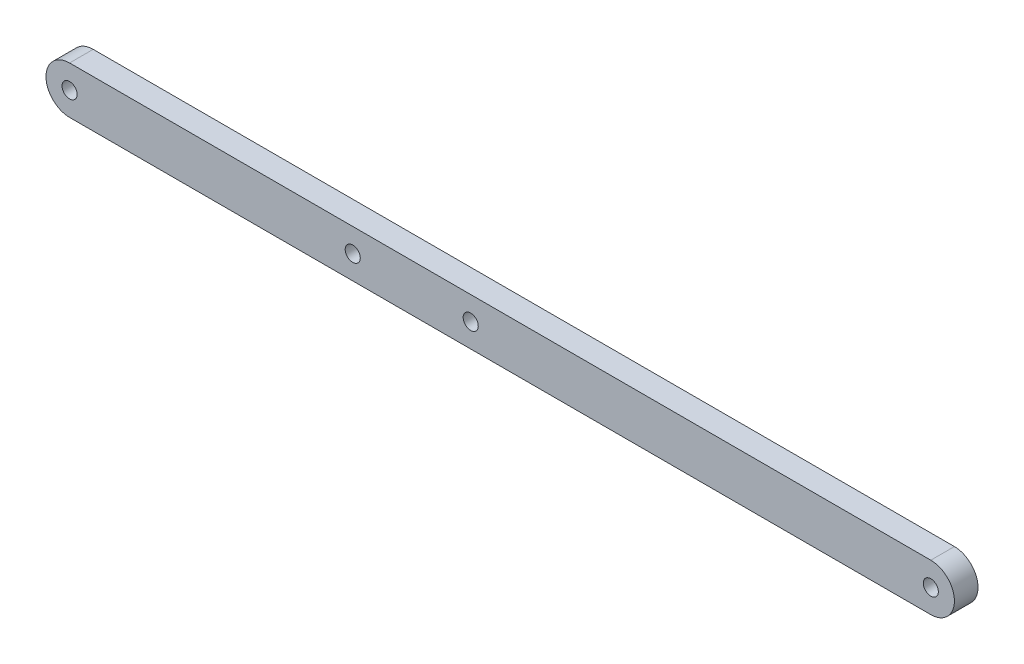
ISO-10303-21;
HEADER;
FILE_DESCRIPTION(('STEP AP214'),'2;1');
FILE_NAME('part.step','',(''),(''),'','','');
FILE_SCHEMA(('AUTOMOTIVE_DESIGN { 1 0 10303 214 1 1 1 1 }'));
ENDSEC;
DATA;
#1=APPLICATION_CONTEXT('core data for automotive mechanical design processes');
#2=APPLICATION_PROTOCOL_DEFINITION('international standard','automotive_design',2000,#1);
#3=PRODUCT_CONTEXT('',#1,'mechanical');
#4=PRODUCT('Part','Part','',(#3));
#5=PRODUCT_RELATED_PRODUCT_CATEGORY('part','',(#4));
#6=PRODUCT_DEFINITION_FORMATION('','',#4);
#7=PRODUCT_DEFINITION_CONTEXT('part definition',#1,'design');
#8=PRODUCT_DEFINITION('design','',#6,#7);
#9=PRODUCT_DEFINITION_SHAPE('','',#8);
#10=(LENGTH_UNIT() NAMED_UNIT(*) SI_UNIT(.MILLI.,.METRE.));
#11=(NAMED_UNIT(*) PLANE_ANGLE_UNIT() SI_UNIT($,.RADIAN.));
#12=(NAMED_UNIT(*) SI_UNIT($,.STERADIAN.) SOLID_ANGLE_UNIT());
#13=UNCERTAINTY_MEASURE_WITH_UNIT(LENGTH_MEASURE(1.E-05),#10,'distance_accuracy_value','');
#14=(GEOMETRIC_REPRESENTATION_CONTEXT(3) GLOBAL_UNCERTAINTY_ASSIGNED_CONTEXT((#13)) GLOBAL_UNIT_ASSIGNED_CONTEXT((#10,
#11,#12)) REPRESENTATION_CONTEXT('',''));
#15=CARTESIAN_POINT('',(0.,0.,0.));
#16=DIRECTION('',(0.,0.,1.));
#17=DIRECTION('',(1.,0.,0.));
#18=AXIS2_PLACEMENT_3D('',#15,#16,#17);
#19=CARTESIAN_POINT('',(0.,0.,3.175));
#20=DIRECTION('',(0.,0.,1.));
#21=DIRECTION('',(1.,0.,0.));
#22=AXIS2_PLACEMENT_3D('',#19,#20,#21);
#23=PLANE('',#22);
#24=CARTESIAN_POINT('',(76.2,0.,3.175));
#25=DIRECTION('',(0.,0.,1.));
#26=DIRECTION('',(1.,0.,0.));
#27=AXIS2_PLACEMENT_3D('',#24,#25,#26);
#28=CIRCLE('',#27,2.03200000000001);
#29=CARTESIAN_POINT('',(78.232,0.,3.175));
#30=VERTEX_POINT('',#29);
#31=EDGE_CURVE('E154',#30,#30,#28,.T.);
#32=ORIENTED_EDGE('',*,*,#31,.F.);
#33=EDGE_LOOP('',(#32));
#34=FACE_BOUND('',#33,.T.);
#35=CARTESIAN_POINT('',(0.,0.,3.175));
#36=DIRECTION('',(0.,0.,1.));
#37=DIRECTION('',(1.,0.,0.));
#38=AXIS2_PLACEMENT_3D('',#35,#36,#37);
#39=CIRCLE('',#38,2.032);
#40=CARTESIAN_POINT('',(2.032,0.,3.175));
#41=VERTEX_POINT('',#40);
#42=EDGE_CURVE('E124',#41,#41,#39,.T.);
#43=ORIENTED_EDGE('',*,*,#42,.F.);
#44=EDGE_LOOP('',(#43));
#45=FACE_BOUND('',#44,.T.);
#46=CARTESIAN_POINT('',(0.,0.,3.175));
#47=DIRECTION('',(0.,0.,1.));
#48=DIRECTION('',(1.,0.,0.));
#49=AXIS2_PLACEMENT_3D('',#46,#47,#48);
#50=CIRCLE('',#49,6.35);
#51=CARTESIAN_POINT('',(0.,6.35,3.175));
#52=VERTEX_POINT('',#51);
#53=CARTESIAN_POINT('',(0.,-6.35,3.175));
#54=VERTEX_POINT('',#53);
#55=EDGE_CURVE('E104',#52,#54,#50,.T.);
#56=ORIENTED_EDGE('',*,*,#55,.T.);
#57=DIRECTION('',(1.,0.,0.));
#58=VECTOR('',#57,1.);
#59=CARTESIAN_POINT('',(0.,-6.35,3.175));
#60=LINE('',#59,#58);
#61=CARTESIAN_POINT('',(231.775,-6.35,3.175));
#62=VERTEX_POINT('',#61);
#63=EDGE_CURVE('E99',#54,#62,#60,.T.);
#64=ORIENTED_EDGE('',*,*,#63,.T.);
#65=CARTESIAN_POINT('',(231.775,0.,3.175));
#66=DIRECTION('',(0.,0.,1.));
#67=DIRECTION('',(1.,0.,0.));
#68=AXIS2_PLACEMENT_3D('',#65,#66,#67);
#69=CIRCLE('',#68,6.35);
#70=CARTESIAN_POINT('',(231.775,6.35,3.175));
#71=VERTEX_POINT('',#70);
#72=EDGE_CURVE('E102',#62,#71,#69,.T.);
#73=ORIENTED_EDGE('',*,*,#72,.T.);
#74=DIRECTION('',(-1.,0.,0.));
#75=VECTOR('',#74,1.);
#76=CARTESIAN_POINT('',(0.,6.35,3.175));
#77=LINE('',#76,#75);
#78=EDGE_CURVE('E67',#71,#52,#77,.T.);
#79=ORIENTED_EDGE('',*,*,#78,.T.);
#80=EDGE_LOOP('',(#56,#64,#73,#79));
#81=FACE_BOUND('',#80,.T.);
#82=CARTESIAN_POINT('',(231.775,0.,3.175));
#83=DIRECTION('',(0.,0.,1.));
#84=DIRECTION('',(1.,0.,0.));
#85=AXIS2_PLACEMENT_3D('',#82,#83,#84);
#86=CIRCLE('',#85,2.03200000000001);
#87=CARTESIAN_POINT('',(233.807,0.,3.175));
#88=VERTEX_POINT('',#87);
#89=EDGE_CURVE('E146',#88,#88,#86,.T.);
#90=ORIENTED_EDGE('',*,*,#89,.F.);
#91=EDGE_LOOP('',(#90));
#92=FACE_BOUND('',#91,.T.);
#93=CARTESIAN_POINT('',(107.95,0.,3.175));
#94=DIRECTION('',(0.,0.,1.));
#95=DIRECTION('',(1.,0.,0.));
#96=AXIS2_PLACEMENT_3D('',#93,#94,#95);
#97=CIRCLE('',#96,2.03200000000001);
#98=CARTESIAN_POINT('',(109.982,0.,3.175));
#99=VERTEX_POINT('',#98);
#100=EDGE_CURVE('E162',#99,#99,#97,.T.);
#101=ORIENTED_EDGE('',*,*,#100,.F.);
#102=EDGE_LOOP('',(#101));
#103=FACE_BOUND('',#102,.T.);
#104=ADVANCED_FACE('F49',(#34,#45,#81,#92,#103),#23,.T.);
#105=CARTESIAN_POINT('',(0.,0.,-3.175));
#106=DIRECTION('',(0.,0.,1.));
#107=DIRECTION('',(1.,0.,0.));
#108=AXIS2_PLACEMENT_3D('',#105,#106,#107);
#109=PLANE('',#108);
#110=CARTESIAN_POINT('',(0.,0.,-3.175));
#111=DIRECTION('',(0.,0.,1.));
#112=DIRECTION('',(1.,0.,0.));
#113=AXIS2_PLACEMENT_3D('',#110,#111,#112);
#114=CIRCLE('',#113,6.35);
#115=CARTESIAN_POINT('',(0.,6.35,-3.175));
#116=VERTEX_POINT('',#115);
#117=CARTESIAN_POINT('',(0.,-6.35,-3.175));
#118=VERTEX_POINT('',#117);
#119=EDGE_CURVE('E120',#116,#118,#114,.T.);
#120=ORIENTED_EDGE('',*,*,#119,.F.);
#121=DIRECTION('',(-1.,0.,0.));
#122=VECTOR('',#121,1.);
#123=CARTESIAN_POINT('',(0.,6.35,-3.175));
#124=LINE('',#123,#122);
#125=CARTESIAN_POINT('',(231.775,6.35,-3.175));
#126=VERTEX_POINT('',#125);
#127=EDGE_CURVE('E91',#126,#116,#124,.T.);
#128=ORIENTED_EDGE('',*,*,#127,.F.);
#129=CARTESIAN_POINT('',(231.775,0.,-3.175));
#130=DIRECTION('',(0.,0.,1.));
#131=DIRECTION('',(1.,0.,0.));
#132=AXIS2_PLACEMENT_3D('',#129,#130,#131);
#133=CIRCLE('',#132,6.35);
#134=CARTESIAN_POINT('',(231.775,-6.35,-3.175));
#135=VERTEX_POINT('',#134);
#136=EDGE_CURVE('E85',#135,#126,#133,.T.);
#137=ORIENTED_EDGE('',*,*,#136,.F.);
#138=DIRECTION('',(1.,0.,0.));
#139=VECTOR('',#138,1.);
#140=CARTESIAN_POINT('',(0.,-6.35,-3.175));
#141=LINE('',#140,#139);
#142=EDGE_CURVE('E109',#118,#135,#141,.T.);
#143=ORIENTED_EDGE('',*,*,#142,.F.);
#144=EDGE_LOOP('',(#120,#128,#137,#143));
#145=FACE_BOUND('',#144,.T.);
#146=CARTESIAN_POINT('',(0.,0.,-3.175));
#147=DIRECTION('',(0.,0.,1.));
#148=DIRECTION('',(1.,0.,0.));
#149=AXIS2_PLACEMENT_3D('',#146,#147,#148);
#150=CIRCLE('',#149,2.032);
#151=CARTESIAN_POINT('',(2.032,0.,-3.175));
#152=VERTEX_POINT('',#151);
#153=EDGE_CURVE('E142',#152,#152,#150,.T.);
#154=ORIENTED_EDGE('',*,*,#153,.T.);
#155=EDGE_LOOP('',(#154));
#156=FACE_BOUND('',#155,.T.);
#157=CARTESIAN_POINT('',(231.775,0.,-3.175));
#158=DIRECTION('',(0.,0.,1.));
#159=DIRECTION('',(1.,0.,0.));
#160=AXIS2_PLACEMENT_3D('',#157,#158,#159);
#161=CIRCLE('',#160,2.03200000000001);
#162=CARTESIAN_POINT('',(233.807,0.,-3.175));
#163=VERTEX_POINT('',#162);
#164=EDGE_CURVE('E150',#163,#163,#161,.T.);
#165=ORIENTED_EDGE('',*,*,#164,.T.);
#166=EDGE_LOOP('',(#165));
#167=FACE_BOUND('',#166,.T.);
#168=CARTESIAN_POINT('',(76.2,0.,-3.175));
#169=DIRECTION('',(0.,0.,1.));
#170=DIRECTION('',(1.,0.,0.));
#171=AXIS2_PLACEMENT_3D('',#168,#169,#170);
#172=CIRCLE('',#171,2.03200000000001);
#173=CARTESIAN_POINT('',(78.232,0.,-3.175));
#174=VERTEX_POINT('',#173);
#175=EDGE_CURVE('E158',#174,#174,#172,.T.);
#176=ORIENTED_EDGE('',*,*,#175,.T.);
#177=EDGE_LOOP('',(#176));
#178=FACE_BOUND('',#177,.T.);
#179=CARTESIAN_POINT('',(107.95,0.,-3.175));
#180=DIRECTION('',(0.,0.,1.));
#181=DIRECTION('',(1.,0.,0.));
#182=AXIS2_PLACEMENT_3D('',#179,#180,#181);
#183=CIRCLE('',#182,2.03200000000001);
#184=CARTESIAN_POINT('',(109.982,0.,-3.175));
#185=VERTEX_POINT('',#184);
#186=EDGE_CURVE('E166',#185,#185,#183,.T.);
#187=ORIENTED_EDGE('',*,*,#186,.T.);
#188=EDGE_LOOP('',(#187));
#189=FACE_BOUND('',#188,.T.);
#190=ADVANCED_FACE('F137',(#145,#156,#167,#178,#189),#109,.F.);
#191=CARTESIAN_POINT('',(0.,0.,3.175));
#192=DIRECTION('',(0.,0.,-1.));
#193=DIRECTION('',(-1.,0.,0.));
#194=AXIS2_PLACEMENT_3D('',#191,#192,#193);
#195=CYLINDRICAL_SURFACE('',#194,6.35);
#196=ORIENTED_EDGE('',*,*,#119,.T.);
#197=DIRECTION('',(0.,0.,-1.));
#198=VECTOR('',#197,1.);
#199=CARTESIAN_POINT('',(0.,-6.35,3.175));
#200=LINE('',#199,#198);
#201=EDGE_CURVE('E11',#54,#118,#200,.T.);
#202=ORIENTED_EDGE('',*,*,#201,.F.);
#203=ORIENTED_EDGE('',*,*,#55,.F.);
#204=DIRECTION('',(0.,0.,-1.));
#205=VECTOR('',#204,1.);
#206=CARTESIAN_POINT('',(0.,6.35,3.175));
#207=LINE('',#206,#205);
#208=EDGE_CURVE('E116',#52,#116,#207,.T.);
#209=ORIENTED_EDGE('',*,*,#208,.T.);
#210=EDGE_LOOP('',(#196,#202,#203,#209));
#211=FACE_BOUND('',#210,.T.);
#212=ADVANCED_FACE('F51',(#211),#195,.T.);
#213=CARTESIAN_POINT('',(0.,-6.35,3.175));
#214=DIRECTION('',(0.,1.,0.));
#215=DIRECTION('',(0.,0.,1.));
#216=AXIS2_PLACEMENT_3D('',#213,#214,#215);
#217=PLANE('',#216);
#218=ORIENTED_EDGE('',*,*,#142,.T.);
#219=DIRECTION('',(0.,0.,-1.));
#220=VECTOR('',#219,1.);
#221=CARTESIAN_POINT('',(231.775,-6.35,3.175));
#222=LINE('',#221,#220);
#223=EDGE_CURVE('E59',#62,#135,#222,.T.);
#224=ORIENTED_EDGE('',*,*,#223,.F.);
#225=ORIENTED_EDGE('',*,*,#63,.F.);
#226=ORIENTED_EDGE('',*,*,#201,.T.);
#227=EDGE_LOOP('',(#218,#224,#225,#226));
#228=FACE_BOUND('',#227,.T.);
#229=ADVANCED_FACE('F108',(#228),#217,.F.);
#230=CARTESIAN_POINT('',(231.775,0.,3.175));
#231=DIRECTION('',(0.,0.,-1.));
#232=DIRECTION('',(-1.,0.,0.));
#233=AXIS2_PLACEMENT_3D('',#230,#231,#232);
#234=CYLINDRICAL_SURFACE('',#233,6.35);
#235=ORIENTED_EDGE('',*,*,#136,.T.);
#236=DIRECTION('',(0.,0.,-1.));
#237=VECTOR('',#236,1.);
#238=CARTESIAN_POINT('',(231.775,6.35,3.175));
#239=LINE('',#238,#237);
#240=EDGE_CURVE('E111',#71,#126,#239,.T.);
#241=ORIENTED_EDGE('',*,*,#240,.F.);
#242=ORIENTED_EDGE('',*,*,#72,.F.);
#243=ORIENTED_EDGE('',*,*,#223,.T.);
#244=EDGE_LOOP('',(#235,#241,#242,#243));
#245=FACE_BOUND('',#244,.T.);
#246=ADVANCED_FACE('F112',(#245),#234,.T.);
#247=CARTESIAN_POINT('',(0.,6.35,3.175));
#248=DIRECTION('',(0.,-1.,0.));
#249=DIRECTION('',(0.,0.,-1.));
#250=AXIS2_PLACEMENT_3D('',#247,#248,#249);
#251=PLANE('',#250);
#252=ORIENTED_EDGE('',*,*,#127,.T.);
#253=ORIENTED_EDGE('',*,*,#208,.F.);
#254=ORIENTED_EDGE('',*,*,#78,.F.);
#255=ORIENTED_EDGE('',*,*,#240,.T.);
#256=EDGE_LOOP('',(#252,#253,#254,#255));
#257=FACE_BOUND('',#256,.T.);
#258=ADVANCED_FACE('F134',(#257),#251,.F.);
#259=CARTESIAN_POINT('',(0.,0.,3.175));
#260=DIRECTION('',(0.,0.,-1.));
#261=DIRECTION('',(-1.,0.,0.));
#262=AXIS2_PLACEMENT_3D('',#259,#260,#261);
#263=CYLINDRICAL_SURFACE('',#262,2.032);
#264=ORIENTED_EDGE('',*,*,#42,.T.);
#265=EDGE_LOOP('',(#264));
#266=FACE_BOUND('',#265,.T.);
#267=ORIENTED_EDGE('',*,*,#153,.F.);
#268=EDGE_LOOP('',(#267));
#269=FACE_BOUND('',#268,.T.);
#270=ADVANCED_FACE('F186',(#266,#269),#263,.F.);
#271=CARTESIAN_POINT('',(231.775,0.,3.175));
#272=DIRECTION('',(0.,0.,-1.));
#273=DIRECTION('',(-1.,0.,0.));
#274=AXIS2_PLACEMENT_3D('',#271,#272,#273);
#275=CYLINDRICAL_SURFACE('',#274,2.03200000000001);
#276=ORIENTED_EDGE('',*,*,#89,.T.);
#277=EDGE_LOOP('',(#276));
#278=FACE_BOUND('',#277,.T.);
#279=ORIENTED_EDGE('',*,*,#164,.F.);
#280=EDGE_LOOP('',(#279));
#281=FACE_BOUND('',#280,.T.);
#282=ADVANCED_FACE('F234',(#278,#281),#275,.F.);
#283=CARTESIAN_POINT('',(76.2,0.,3.175));
#284=DIRECTION('',(0.,0.,-1.));
#285=DIRECTION('',(-1.,0.,0.));
#286=AXIS2_PLACEMENT_3D('',#283,#284,#285);
#287=CYLINDRICAL_SURFACE('',#286,2.03200000000001);
#288=ORIENTED_EDGE('',*,*,#31,.T.);
#289=EDGE_LOOP('',(#288));
#290=FACE_BOUND('',#289,.T.);
#291=ORIENTED_EDGE('',*,*,#175,.F.);
#292=EDGE_LOOP('',(#291));
#293=FACE_BOUND('',#292,.T.);
#294=ADVANCED_FACE('F242',(#290,#293),#287,.F.);
#295=CARTESIAN_POINT('',(107.95,0.,3.175));
#296=DIRECTION('',(0.,0.,-1.));
#297=DIRECTION('',(-1.,0.,0.));
#298=AXIS2_PLACEMENT_3D('',#295,#296,#297);
#299=CYLINDRICAL_SURFACE('',#298,2.03200000000001);
#300=ORIENTED_EDGE('',*,*,#100,.T.);
#301=EDGE_LOOP('',(#300));
#302=FACE_BOUND('',#301,.T.);
#303=ORIENTED_EDGE('',*,*,#186,.F.);
#304=EDGE_LOOP('',(#303));
#305=FACE_BOUND('',#304,.T.);
#306=ADVANCED_FACE('F174',(#302,#305),#299,.F.);
#307=CLOSED_SHELL('',(#104,#190,#212,#229,#246,#258,#270,#282,#294,#306));
#308=MANIFOLD_SOLID_BREP('B2',#307);
#309=ADVANCED_BREP_SHAPE_REPRESENTATION('',(#18,#308),#14);
#310=SHAPE_DEFINITION_REPRESENTATION(#9,#309);
ENDSEC;
END-ISO-10303-21;
